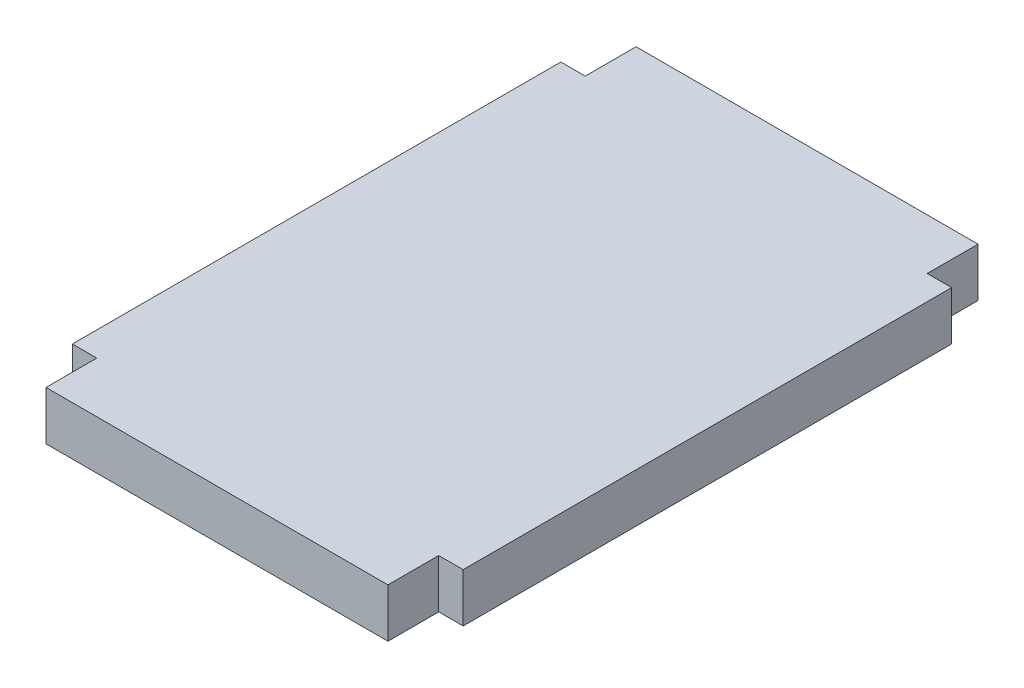
ISO-10303-21;
HEADER;
FILE_DESCRIPTION(('STEP AP214'),'2;1');
FILE_NAME('part.step','',(''),(''),'','','');
FILE_SCHEMA(('AUTOMOTIVE_DESIGN { 1 0 10303 214 1 1 1 1 }'));
ENDSEC;
DATA;
#1=APPLICATION_CONTEXT('core data for automotive mechanical design processes');
#2=APPLICATION_PROTOCOL_DEFINITION('international standard','automotive_design',2000,#1);
#3=PRODUCT_CONTEXT('',#1,'mechanical');
#4=PRODUCT('Part','Part','',(#3));
#5=PRODUCT_RELATED_PRODUCT_CATEGORY('part','',(#4));
#6=PRODUCT_DEFINITION_FORMATION('','',#4);
#7=PRODUCT_DEFINITION_CONTEXT('part definition',#1,'design');
#8=PRODUCT_DEFINITION('design','',#6,#7);
#9=PRODUCT_DEFINITION_SHAPE('','',#8);
#10=(LENGTH_UNIT() NAMED_UNIT(*) SI_UNIT(.MILLI.,.METRE.));
#11=(NAMED_UNIT(*) PLANE_ANGLE_UNIT() SI_UNIT($,.RADIAN.));
#12=(NAMED_UNIT(*) SI_UNIT($,.STERADIAN.) SOLID_ANGLE_UNIT());
#13=UNCERTAINTY_MEASURE_WITH_UNIT(LENGTH_MEASURE(1.E-05),#10,'distance_accuracy_value','');
#14=(GEOMETRIC_REPRESENTATION_CONTEXT(3) GLOBAL_UNCERTAINTY_ASSIGNED_CONTEXT((#13)) GLOBAL_UNIT_ASSIGNED_CONTEXT((#10,
#11,#12)) REPRESENTATION_CONTEXT('',''));
#15=CARTESIAN_POINT('',(0.,0.,0.));
#16=DIRECTION('',(0.,0.,1.));
#17=DIRECTION('',(1.,0.,0.));
#18=AXIS2_PLACEMENT_3D('',#15,#16,#17);
#19=CARTESIAN_POINT('',(22.225,6.35,31.75));
#20=DIRECTION('',(0.,0.,-1.));
#21=DIRECTION('',(-1.,0.,0.));
#22=AXIS2_PLACEMENT_3D('',#19,#20,#21);
#23=PLANE('',#22);
#24=DIRECTION('',(1.,0.,0.));
#25=VECTOR('',#24,1.);
#26=CARTESIAN_POINT('',(22.225,0.,31.75));
#27=LINE('',#26,#25);
#28=CARTESIAN_POINT('',(22.225,0.,31.75));
#29=VERTEX_POINT('',#28);
#30=CARTESIAN_POINT('',(25.4,0.,31.75));
#31=VERTEX_POINT('',#30);
#32=EDGE_CURVE('E168',#29,#31,#27,.T.);
#33=ORIENTED_EDGE('',*,*,#32,.T.);
#34=DIRECTION('',(0.,-1.,0.));
#35=VECTOR('',#34,1.);
#36=CARTESIAN_POINT('',(25.4,6.35,31.75));
#37=LINE('',#36,#35);
#38=CARTESIAN_POINT('',(25.4,6.35,31.75));
#39=VERTEX_POINT('',#38);
#40=EDGE_CURVE('E11',#39,#31,#37,.T.);
#41=ORIENTED_EDGE('',*,*,#40,.F.);
#42=DIRECTION('',(1.,0.,0.));
#43=VECTOR('',#42,1.);
#44=CARTESIAN_POINT('',(22.225,6.35,31.75));
#45=LINE('',#44,#43);
#46=CARTESIAN_POINT('',(22.225,6.35,31.75));
#47=VERTEX_POINT('',#46);
#48=EDGE_CURVE('E202',#47,#39,#45,.T.);
#49=ORIENTED_EDGE('',*,*,#48,.F.);
#50=DIRECTION('',(0.,-1.,0.));
#51=VECTOR('',#50,1.);
#52=CARTESIAN_POINT('',(22.225,6.35,31.75));
#53=LINE('',#52,#51);
#54=EDGE_CURVE('E164',#47,#29,#53,.T.);
#55=ORIENTED_EDGE('',*,*,#54,.T.);
#56=EDGE_LOOP('',(#33,#41,#49,#55));
#57=FACE_BOUND('',#56,.T.);
#58=ADVANCED_FACE('F43',(#57),#23,.F.);
#59=CARTESIAN_POINT('',(25.4,6.35,-31.75));
#60=DIRECTION('',(-1.,0.,0.));
#61=DIRECTION('',(0.,0.,1.));
#62=AXIS2_PLACEMENT_3D('',#59,#60,#61);
#63=PLANE('',#62);
#64=DIRECTION('',(0.,0.,-1.));
#65=VECTOR('',#64,1.);
#66=CARTESIAN_POINT('',(25.4,0.,-31.75));
#67=LINE('',#66,#65);
#68=CARTESIAN_POINT('',(25.4,0.,-31.75));
#69=VERTEX_POINT('',#68);
#70=EDGE_CURVE('E172',#31,#69,#67,.T.);
#71=ORIENTED_EDGE('',*,*,#70,.T.);
#72=DIRECTION('',(0.,-1.,0.));
#73=VECTOR('',#72,1.);
#74=CARTESIAN_POINT('',(25.4,6.35,-31.75));
#75=LINE('',#74,#73);
#76=CARTESIAN_POINT('',(25.4,6.35,-31.75));
#77=VERTEX_POINT('',#76);
#78=EDGE_CURVE('E52',#77,#69,#75,.T.);
#79=ORIENTED_EDGE('',*,*,#78,.F.);
#80=DIRECTION('',(0.,0.,-1.));
#81=VECTOR('',#80,1.);
#82=CARTESIAN_POINT('',(25.4,6.35,-31.75));
#83=LINE('',#82,#81);
#84=EDGE_CURVE('E115',#39,#77,#83,.T.);
#85=ORIENTED_EDGE('',*,*,#84,.F.);
#86=ORIENTED_EDGE('',*,*,#40,.T.);
#87=EDGE_LOOP('',(#71,#79,#85,#86));
#88=FACE_BOUND('',#87,.T.);
#89=ADVANCED_FACE('F296',(#88),#63,.F.);
#90=CARTESIAN_POINT('',(22.225,6.35,-31.75));
#91=DIRECTION('',(0.,0.,1.));
#92=DIRECTION('',(1.,0.,0.));
#93=AXIS2_PLACEMENT_3D('',#90,#91,#92);
#94=PLANE('',#93);
#95=DIRECTION('',(-1.,0.,0.));
#96=VECTOR('',#95,1.);
#97=CARTESIAN_POINT('',(22.225,0.,-31.75));
#98=LINE('',#97,#96);
#99=CARTESIAN_POINT('',(22.225,0.,-31.75));
#100=VERTEX_POINT('',#99);
#101=EDGE_CURVE('E175',#69,#100,#98,.T.);
#102=ORIENTED_EDGE('',*,*,#101,.T.);
#103=DIRECTION('',(0.,-1.,0.));
#104=VECTOR('',#103,1.);
#105=CARTESIAN_POINT('',(22.225,6.35,-31.75));
#106=LINE('',#105,#104);
#107=CARTESIAN_POINT('',(22.225,6.35,-31.75));
#108=VERTEX_POINT('',#107);
#109=EDGE_CURVE('E229',#108,#100,#106,.T.);
#110=ORIENTED_EDGE('',*,*,#109,.F.);
#111=DIRECTION('',(-1.,0.,0.));
#112=VECTOR('',#111,1.);
#113=CARTESIAN_POINT('',(22.225,6.35,-31.75));
#114=LINE('',#113,#112);
#115=EDGE_CURVE('E239',#77,#108,#114,.T.);
#116=ORIENTED_EDGE('',*,*,#115,.F.);
#117=ORIENTED_EDGE('',*,*,#78,.T.);
#118=EDGE_LOOP('',(#102,#110,#116,#117));
#119=FACE_BOUND('',#118,.T.);
#120=ADVANCED_FACE('F237',(#119),#94,.F.);
#121=CARTESIAN_POINT('',(22.225,6.35,-38.354));
#122=DIRECTION('',(-1.,0.,0.));
#123=DIRECTION('',(0.,0.,1.));
#124=AXIS2_PLACEMENT_3D('',#121,#122,#123);
#125=PLANE('',#124);
#126=DIRECTION('',(0.,0.,-1.));
#127=VECTOR('',#126,1.);
#128=CARTESIAN_POINT('',(22.225,0.,-38.354));
#129=LINE('',#128,#127);
#130=CARTESIAN_POINT('',(22.225,0.,-38.354));
#131=VERTEX_POINT('',#130);
#132=EDGE_CURVE('E178',#100,#131,#129,.T.);
#133=ORIENTED_EDGE('',*,*,#132,.T.);
#134=DIRECTION('',(0.,-1.,0.));
#135=VECTOR('',#134,1.);
#136=CARTESIAN_POINT('',(22.225,6.35,-38.354));
#137=LINE('',#136,#135);
#138=CARTESIAN_POINT('',(22.225,6.35,-38.354));
#139=VERTEX_POINT('',#138);
#140=EDGE_CURVE('E225',#139,#131,#137,.T.);
#141=ORIENTED_EDGE('',*,*,#140,.F.);
#142=DIRECTION('',(0.,0.,-1.));
#143=VECTOR('',#142,1.);
#144=CARTESIAN_POINT('',(22.225,6.35,-38.354));
#145=LINE('',#144,#143);
#146=EDGE_CURVE('E258',#108,#139,#145,.T.);
#147=ORIENTED_EDGE('',*,*,#146,.F.);
#148=ORIENTED_EDGE('',*,*,#109,.T.);
#149=EDGE_LOOP('',(#133,#141,#147,#148));
#150=FACE_BOUND('',#149,.T.);
#151=ADVANCED_FACE('F248',(#150),#125,.F.);
#152=CARTESIAN_POINT('',(-22.225,6.35,-38.354));
#153=DIRECTION('',(0.,0.,1.));
#154=DIRECTION('',(1.,0.,0.));
#155=AXIS2_PLACEMENT_3D('',#152,#153,#154);
#156=PLANE('',#155);
#157=DIRECTION('',(-1.,0.,0.));
#158=VECTOR('',#157,1.);
#159=CARTESIAN_POINT('',(-22.225,0.,-38.354));
#160=LINE('',#159,#158);
#161=CARTESIAN_POINT('',(-22.225,0.,-38.354));
#162=VERTEX_POINT('',#161);
#163=EDGE_CURVE('E181',#131,#162,#160,.T.);
#164=ORIENTED_EDGE('',*,*,#163,.T.);
#165=DIRECTION('',(0.,-1.,0.));
#166=VECTOR('',#165,1.);
#167=CARTESIAN_POINT('',(-22.225,6.35,-38.354));
#168=LINE('',#167,#166);
#169=CARTESIAN_POINT('',(-22.225,6.35,-38.354));
#170=VERTEX_POINT('',#169);
#171=EDGE_CURVE('E221',#170,#162,#168,.T.);
#172=ORIENTED_EDGE('',*,*,#171,.F.);
#173=DIRECTION('',(-1.,0.,0.));
#174=VECTOR('',#173,1.);
#175=CARTESIAN_POINT('',(-22.225,6.35,-38.354));
#176=LINE('',#175,#174);
#177=EDGE_CURVE('E254',#139,#170,#176,.T.);
#178=ORIENTED_EDGE('',*,*,#177,.F.);
#179=ORIENTED_EDGE('',*,*,#140,.T.);
#180=EDGE_LOOP('',(#164,#172,#178,#179));
#181=FACE_BOUND('',#180,.T.);
#182=ADVANCED_FACE('F252',(#181),#156,.F.);
#183=CARTESIAN_POINT('',(-22.225,6.35,-31.75));
#184=DIRECTION('',(1.,0.,0.));
#185=DIRECTION('',(0.,0.,-1.));
#186=AXIS2_PLACEMENT_3D('',#183,#184,#185);
#187=PLANE('',#186);
#188=DIRECTION('',(0.,0.,1.));
#189=VECTOR('',#188,1.);
#190=CARTESIAN_POINT('',(-22.225,0.,-31.75));
#191=LINE('',#190,#189);
#192=CARTESIAN_POINT('',(-22.225,0.,-31.75));
#193=VERTEX_POINT('',#192);
#194=EDGE_CURVE('E184',#162,#193,#191,.T.);
#195=ORIENTED_EDGE('',*,*,#194,.T.);
#196=DIRECTION('',(0.,-1.,0.));
#197=VECTOR('',#196,1.);
#198=CARTESIAN_POINT('',(-22.225,6.35,-31.75));
#199=LINE('',#198,#197);
#200=CARTESIAN_POINT('',(-22.225,6.35,-31.75));
#201=VERTEX_POINT('',#200);
#202=EDGE_CURVE('E217',#201,#193,#199,.T.);
#203=ORIENTED_EDGE('',*,*,#202,.F.);
#204=DIRECTION('',(0.,0.,1.));
#205=VECTOR('',#204,1.);
#206=CARTESIAN_POINT('',(-22.225,6.35,-31.75));
#207=LINE('',#206,#205);
#208=EDGE_CURVE('E257',#170,#201,#207,.T.);
#209=ORIENTED_EDGE('',*,*,#208,.F.);
#210=ORIENTED_EDGE('',*,*,#171,.T.);
#211=EDGE_LOOP('',(#195,#203,#209,#210));
#212=FACE_BOUND('',#211,.T.);
#213=ADVANCED_FACE('F309',(#212),#187,.F.);
#214=CARTESIAN_POINT('',(-25.4,6.35,-31.75));
#215=DIRECTION('',(0.,0.,1.));
#216=DIRECTION('',(1.,0.,0.));
#217=AXIS2_PLACEMENT_3D('',#214,#215,#216);
#218=PLANE('',#217);
#219=DIRECTION('',(-1.,0.,0.));
#220=VECTOR('',#219,1.);
#221=CARTESIAN_POINT('',(-25.4,0.,-31.75));
#222=LINE('',#221,#220);
#223=CARTESIAN_POINT('',(-25.4,0.,-31.75));
#224=VERTEX_POINT('',#223);
#225=EDGE_CURVE('E187',#193,#224,#222,.T.);
#226=ORIENTED_EDGE('',*,*,#225,.T.);
#227=DIRECTION('',(0.,-1.,0.));
#228=VECTOR('',#227,1.);
#229=CARTESIAN_POINT('',(-25.4,6.35,-31.75));
#230=LINE('',#229,#228);
#231=CARTESIAN_POINT('',(-25.4,6.35,-31.75));
#232=VERTEX_POINT('',#231);
#233=EDGE_CURVE('E213',#232,#224,#230,.T.);
#234=ORIENTED_EDGE('',*,*,#233,.F.);
#235=DIRECTION('',(-1.,0.,0.));
#236=VECTOR('',#235,1.);
#237=CARTESIAN_POINT('',(-25.4,6.35,-31.75));
#238=LINE('',#237,#236);
#239=EDGE_CURVE('E262',#201,#232,#238,.T.);
#240=ORIENTED_EDGE('',*,*,#239,.F.);
#241=ORIENTED_EDGE('',*,*,#202,.T.);
#242=EDGE_LOOP('',(#226,#234,#240,#241));
#243=FACE_BOUND('',#242,.T.);
#244=ADVANCED_FACE('F312',(#243),#218,.F.);
#245=CARTESIAN_POINT('',(-25.4,6.35,-31.75));
#246=DIRECTION('',(1.,0.,0.));
#247=DIRECTION('',(0.,0.,-1.));
#248=AXIS2_PLACEMENT_3D('',#245,#246,#247);
#249=PLANE('',#248);
#250=DIRECTION('',(0.,0.,1.));
#251=VECTOR('',#250,1.);
#252=CARTESIAN_POINT('',(-25.4,0.,-31.75));
#253=LINE('',#252,#251);
#254=CARTESIAN_POINT('',(-25.4,0.,31.75));
#255=VERTEX_POINT('',#254);
#256=EDGE_CURVE('E190',#224,#255,#253,.T.);
#257=ORIENTED_EDGE('',*,*,#256,.T.);
#258=DIRECTION('',(0.,-1.,0.));
#259=VECTOR('',#258,1.);
#260=CARTESIAN_POINT('',(-25.4,6.35,31.75));
#261=LINE('',#260,#259);
#262=CARTESIAN_POINT('',(-25.4,6.35,31.75));
#263=VERTEX_POINT('',#262);
#264=EDGE_CURVE('E209',#263,#255,#261,.T.);
#265=ORIENTED_EDGE('',*,*,#264,.F.);
#266=DIRECTION('',(0.,0.,1.));
#267=VECTOR('',#266,1.);
#268=CARTESIAN_POINT('',(-25.4,6.35,-31.75));
#269=LINE('',#268,#267);
#270=EDGE_CURVE('E269',#232,#263,#269,.T.);
#271=ORIENTED_EDGE('',*,*,#270,.F.);
#272=ORIENTED_EDGE('',*,*,#233,.T.);
#273=EDGE_LOOP('',(#257,#265,#271,#272));
#274=FACE_BOUND('',#273,.T.);
#275=ADVANCED_FACE('F277',(#274),#249,.F.);
#276=CARTESIAN_POINT('',(-25.4,6.35,31.75));
#277=DIRECTION('',(0.,0.,-1.));
#278=DIRECTION('',(-1.,0.,0.));
#279=AXIS2_PLACEMENT_3D('',#276,#277,#278);
#280=PLANE('',#279);
#281=DIRECTION('',(1.,0.,0.));
#282=VECTOR('',#281,1.);
#283=CARTESIAN_POINT('',(-25.4,0.,31.75));
#284=LINE('',#283,#282);
#285=CARTESIAN_POINT('',(-22.225,0.,31.75));
#286=VERTEX_POINT('',#285);
#287=EDGE_CURVE('E193',#255,#286,#284,.T.);
#288=ORIENTED_EDGE('',*,*,#287,.T.);
#289=DIRECTION('',(0.,-1.,0.));
#290=VECTOR('',#289,1.);
#291=CARTESIAN_POINT('',(-22.225,6.35,31.75));
#292=LINE('',#291,#290);
#293=CARTESIAN_POINT('',(-22.225,6.35,31.75));
#294=VERTEX_POINT('',#293);
#295=EDGE_CURVE('E157',#294,#286,#292,.T.);
#296=ORIENTED_EDGE('',*,*,#295,.F.);
#297=DIRECTION('',(1.,0.,0.));
#298=VECTOR('',#297,1.);
#299=CARTESIAN_POINT('',(-25.4,6.35,31.75));
#300=LINE('',#299,#298);
#301=EDGE_CURVE('E146',#263,#294,#300,.T.);
#302=ORIENTED_EDGE('',*,*,#301,.F.);
#303=ORIENTED_EDGE('',*,*,#264,.T.);
#304=EDGE_LOOP('',(#288,#296,#302,#303));
#305=FACE_BOUND('',#304,.T.);
#306=ADVANCED_FACE('F281',(#305),#280,.F.);
#307=CARTESIAN_POINT('',(-22.225,6.35,31.75));
#308=DIRECTION('',(1.,0.,0.));
#309=DIRECTION('',(0.,0.,-1.));
#310=AXIS2_PLACEMENT_3D('',#307,#308,#309);
#311=PLANE('',#310);
#312=DIRECTION('',(0.,0.,1.));
#313=VECTOR('',#312,1.);
#314=CARTESIAN_POINT('',(-22.225,0.,31.75));
#315=LINE('',#314,#313);
#316=CARTESIAN_POINT('',(-22.225,0.,38.354));
#317=VERTEX_POINT('',#316);
#318=EDGE_CURVE('E155',#286,#317,#315,.T.);
#319=ORIENTED_EDGE('',*,*,#318,.T.);
#320=DIRECTION('',(0.,-1.,0.));
#321=VECTOR('',#320,1.);
#322=CARTESIAN_POINT('',(-22.225,6.35,38.354));
#323=LINE('',#322,#321);
#324=CARTESIAN_POINT('',(-22.225,6.35,38.354));
#325=VERTEX_POINT('',#324);
#326=EDGE_CURVE('E152',#325,#317,#323,.T.);
#327=ORIENTED_EDGE('',*,*,#326,.F.);
#328=DIRECTION('',(0.,0.,1.));
#329=VECTOR('',#328,1.);
#330=CARTESIAN_POINT('',(-22.225,6.35,31.75));
#331=LINE('',#330,#329);
#332=EDGE_CURVE('E140',#294,#325,#331,.T.);
#333=ORIENTED_EDGE('',*,*,#332,.F.);
#334=ORIENTED_EDGE('',*,*,#295,.T.);
#335=EDGE_LOOP('',(#319,#327,#333,#334));
#336=FACE_BOUND('',#335,.T.);
#337=ADVANCED_FACE('F153',(#336),#311,.F.);
#338=CARTESIAN_POINT('',(-22.225,6.35,38.354));
#339=DIRECTION('',(0.,0.,-1.));
#340=DIRECTION('',(-1.,0.,0.));
#341=AXIS2_PLACEMENT_3D('',#338,#339,#340);
#342=PLANE('',#341);
#343=DIRECTION('',(1.,0.,0.));
#344=VECTOR('',#343,1.);
#345=CARTESIAN_POINT('',(-22.225,0.,38.354));
#346=LINE('',#345,#344);
#347=CARTESIAN_POINT('',(22.225,0.,38.354));
#348=VERTEX_POINT('',#347);
#349=EDGE_CURVE('E101',#317,#348,#346,.T.);
#350=ORIENTED_EDGE('',*,*,#349,.T.);
#351=DIRECTION('',(0.,-1.,0.));
#352=VECTOR('',#351,1.);
#353=CARTESIAN_POINT('',(22.225,6.35,38.354));
#354=LINE('',#353,#352);
#355=CARTESIAN_POINT('',(22.225,6.35,38.354));
#356=VERTEX_POINT('',#355);
#357=EDGE_CURVE('E158',#356,#348,#354,.T.);
#358=ORIENTED_EDGE('',*,*,#357,.F.);
#359=DIRECTION('',(1.,0.,0.));
#360=VECTOR('',#359,1.);
#361=CARTESIAN_POINT('',(-22.225,6.35,38.354));
#362=LINE('',#361,#360);
#363=EDGE_CURVE('E144',#325,#356,#362,.T.);
#364=ORIENTED_EDGE('',*,*,#363,.F.);
#365=ORIENTED_EDGE('',*,*,#326,.T.);
#366=EDGE_LOOP('',(#350,#358,#364,#365));
#367=FACE_BOUND('',#366,.T.);
#368=ADVANCED_FACE('F160',(#367),#342,.F.);
#369=CARTESIAN_POINT('',(22.225,6.35,38.354));
#370=DIRECTION('',(-1.,0.,0.));
#371=DIRECTION('',(0.,0.,1.));
#372=AXIS2_PLACEMENT_3D('',#369,#370,#371);
#373=PLANE('',#372);
#374=DIRECTION('',(0.,0.,-1.));
#375=VECTOR('',#374,1.);
#376=CARTESIAN_POINT('',(22.225,0.,38.354));
#377=LINE('',#376,#375);
#378=EDGE_CURVE('E107',#348,#29,#377,.T.);
#379=ORIENTED_EDGE('',*,*,#378,.T.);
#380=ORIENTED_EDGE('',*,*,#54,.F.);
#381=DIRECTION('',(0.,0.,-1.));
#382=VECTOR('',#381,1.);
#383=CARTESIAN_POINT('',(22.225,6.35,38.354));
#384=LINE('',#383,#382);
#385=EDGE_CURVE('E60',#356,#47,#384,.T.);
#386=ORIENTED_EDGE('',*,*,#385,.F.);
#387=ORIENTED_EDGE('',*,*,#357,.T.);
#388=EDGE_LOOP('',(#379,#380,#386,#387));
#389=FACE_BOUND('',#388,.T.);
#390=ADVANCED_FACE('F285',(#389),#373,.F.);
#391=CARTESIAN_POINT('',(0.,6.35,0.));
#392=DIRECTION('',(0.,-1.,0.));
#393=DIRECTION('',(0.,0.,-1.));
#394=AXIS2_PLACEMENT_3D('',#391,#392,#393);
#395=PLANE('',#394);
#396=ORIENTED_EDGE('',*,*,#48,.T.);
#397=ORIENTED_EDGE('',*,*,#84,.T.);
#398=ORIENTED_EDGE('',*,*,#115,.T.);
#399=ORIENTED_EDGE('',*,*,#146,.T.);
#400=ORIENTED_EDGE('',*,*,#177,.T.);
#401=ORIENTED_EDGE('',*,*,#208,.T.);
#402=ORIENTED_EDGE('',*,*,#239,.T.);
#403=ORIENTED_EDGE('',*,*,#270,.T.);
#404=ORIENTED_EDGE('',*,*,#301,.T.);
#405=ORIENTED_EDGE('',*,*,#332,.T.);
#406=ORIENTED_EDGE('',*,*,#363,.T.);
#407=ORIENTED_EDGE('',*,*,#385,.T.);
#408=EDGE_LOOP('',(#396,#397,#398,#399,#400,#401,#402,#403,#404,#405,#406,#407));
#409=FACE_BOUND('',#408,.T.);
#410=ADVANCED_FACE('F142',(#409),#395,.F.);
#411=CARTESIAN_POINT('',(0.,0.,0.));
#412=DIRECTION('',(0.,-1.,0.));
#413=DIRECTION('',(0.,0.,-1.));
#414=AXIS2_PLACEMENT_3D('',#411,#412,#413);
#415=PLANE('',#414);
#416=ORIENTED_EDGE('',*,*,#32,.F.);
#417=ORIENTED_EDGE('',*,*,#378,.F.);
#418=ORIENTED_EDGE('',*,*,#349,.F.);
#419=ORIENTED_EDGE('',*,*,#318,.F.);
#420=ORIENTED_EDGE('',*,*,#287,.F.);
#421=ORIENTED_EDGE('',*,*,#256,.F.);
#422=ORIENTED_EDGE('',*,*,#225,.F.);
#423=ORIENTED_EDGE('',*,*,#194,.F.);
#424=ORIENTED_EDGE('',*,*,#163,.F.);
#425=ORIENTED_EDGE('',*,*,#132,.F.);
#426=ORIENTED_EDGE('',*,*,#101,.F.);
#427=ORIENTED_EDGE('',*,*,#70,.F.);
#428=EDGE_LOOP('',(#416,#417,#418,#419,#420,#421,#422,#423,#424,#425,#426,#427));
#429=FACE_BOUND('',#428,.T.);
#430=ADVANCED_FACE('F243',(#429),#415,.T.);
#431=CLOSED_SHELL('',(#58,#89,#120,#151,#182,#213,#244,#275,#306,#337,#368,#390,#410,#430));
#432=MANIFOLD_SOLID_BREP('B2',#431);
#433=ADVANCED_BREP_SHAPE_REPRESENTATION('',(#18,#432),#14);
#434=SHAPE_DEFINITION_REPRESENTATION(#9,#433);
ENDSEC;
END-ISO-10303-21;
